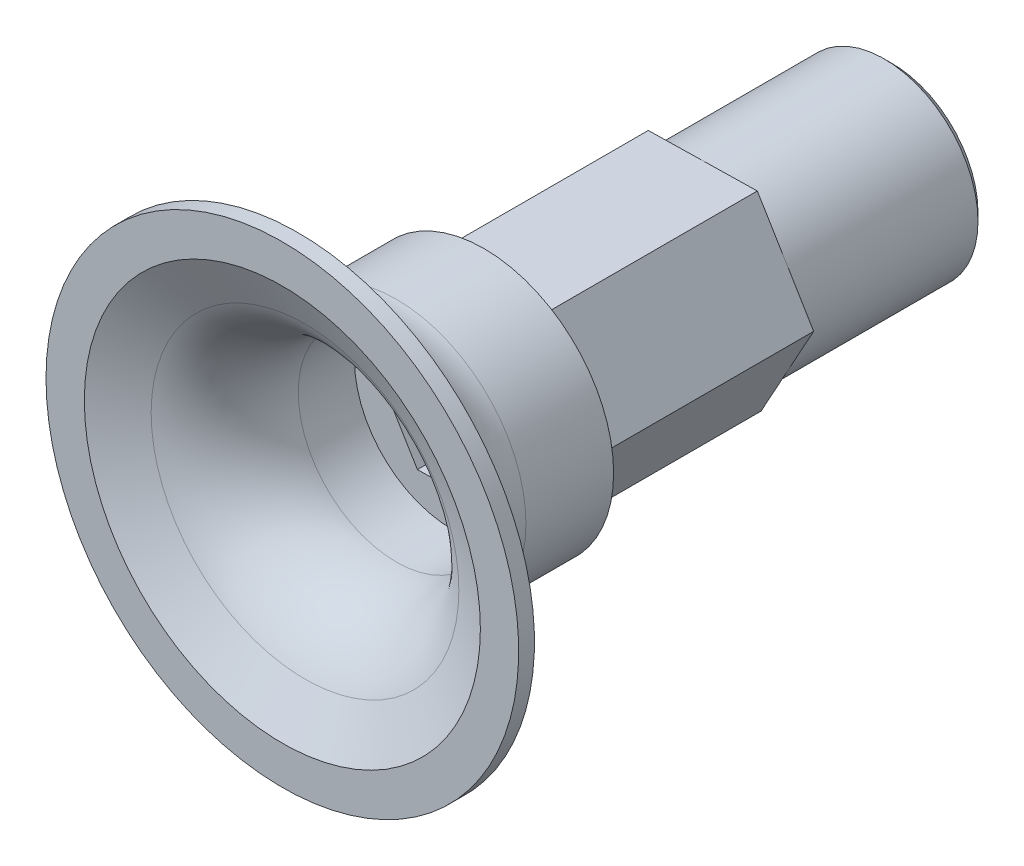
ISO-10303-21;
HEADER;
FILE_DESCRIPTION(('STEP AP214'),'2;1');
FILE_NAME('part.step','',(''),(''),'','','');
FILE_SCHEMA(('AUTOMOTIVE_DESIGN { 1 0 10303 214 1 1 1 1 }'));
ENDSEC;
DATA;
#1=APPLICATION_CONTEXT('core data for automotive mechanical design processes');
#2=APPLICATION_PROTOCOL_DEFINITION('international standard','automotive_design',2000,#1);
#3=PRODUCT_CONTEXT('',#1,'mechanical');
#4=PRODUCT('Part','Part','',(#3));
#5=PRODUCT_RELATED_PRODUCT_CATEGORY('part','',(#4));
#6=PRODUCT_DEFINITION_FORMATION('','',#4);
#7=PRODUCT_DEFINITION_CONTEXT('part definition',#1,'design');
#8=PRODUCT_DEFINITION('design','',#6,#7);
#9=PRODUCT_DEFINITION_SHAPE('','',#8);
#10=(LENGTH_UNIT() NAMED_UNIT(*) SI_UNIT(.MILLI.,.METRE.));
#11=(NAMED_UNIT(*) PLANE_ANGLE_UNIT() SI_UNIT($,.RADIAN.));
#12=(NAMED_UNIT(*) SI_UNIT($,.STERADIAN.) SOLID_ANGLE_UNIT());
#13=UNCERTAINTY_MEASURE_WITH_UNIT(LENGTH_MEASURE(1.E-05),#10,'distance_accuracy_value','');
#14=(GEOMETRIC_REPRESENTATION_CONTEXT(3) GLOBAL_UNCERTAINTY_ASSIGNED_CONTEXT((#13)) GLOBAL_UNIT_ASSIGNED_CONTEXT((#10,
#11,#12)) REPRESENTATION_CONTEXT('',''));
#15=CARTESIAN_POINT('',(0.,0.,0.));
#16=DIRECTION('',(0.,0.,1.));
#17=DIRECTION('',(1.,0.,0.));
#18=AXIS2_PLACEMENT_3D('',#15,#16,#17);
#19=CARTESIAN_POINT('',(0.,0.,11.9));
#20=DIRECTION('',(0.,0.,-1.));
#21=DIRECTION('',(-1.,0.,0.));
#22=AXIS2_PLACEMENT_3D('',#19,#20,#21);
#23=CYLINDRICAL_SURFACE('',#22,5.95);
#24=CARTESIAN_POINT('',(0.,0.,0.499999999999997));
#25=DIRECTION('',(0.,0.,1.));
#26=DIRECTION('',(1.,0.,0.));
#27=AXIS2_PLACEMENT_3D('',#24,#25,#26);
#28=CIRCLE('',#27,5.95);
#29=CARTESIAN_POINT('',(5.95,0.,0.499999999999997));
#30=VERTEX_POINT('',#29);
#31=EDGE_CURVE('E44',#30,#30,#28,.T.);
#32=ORIENTED_EDGE('',*,*,#31,.T.);
#33=EDGE_LOOP('',(#32));
#34=FACE_BOUND('',#33,.T.);
#35=CARTESIAN_POINT('',(0.,0.,11.9));
#36=DIRECTION('',(0.,0.,1.));
#37=DIRECTION('',(1.,0.,0.));
#38=AXIS2_PLACEMENT_3D('',#35,#36,#37);
#39=CIRCLE('',#38,5.95);
#40=CARTESIAN_POINT('',(5.95,0.,11.9));
#41=VERTEX_POINT('',#40);
#42=EDGE_CURVE('E151',#41,#41,#39,.T.);
#43=ORIENTED_EDGE('',*,*,#42,.F.);
#44=EDGE_LOOP('',(#43));
#45=FACE_BOUND('',#44,.T.);
#46=ADVANCED_FACE('F34',(#34,#45),#23,.T.);
#47=CARTESIAN_POINT('',(0.,0.,0.));
#48=DIRECTION('',(0.,0.,1.));
#49=DIRECTION('',(1.,0.,0.));
#50=AXIS2_PLACEMENT_3D('',#47,#48,#49);
#51=PLANE('',#50);
#52=CARTESIAN_POINT('',(0.,0.,0.));
#53=DIRECTION('',(0.,0.,1.));
#54=DIRECTION('',(1.,0.,0.));
#55=AXIS2_PLACEMENT_3D('',#52,#53,#54);
#56=CIRCLE('',#55,5.45);
#57=CARTESIAN_POINT('',(5.45,0.,0.));
#58=VERTEX_POINT('',#57);
#59=EDGE_CURVE('E11',#58,#58,#56,.F.);
#60=ORIENTED_EDGE('',*,*,#59,.T.);
#61=EDGE_LOOP('',(#60));
#62=FACE_BOUND('',#61,.T.);
#63=CARTESIAN_POINT('',(0.,0.,0.));
#64=DIRECTION('',(0.,0.,-1.));
#65=DIRECTION('',(-1.,0.,0.));
#66=AXIS2_PLACEMENT_3D('',#63,#64,#65);
#67=CIRCLE('',#66,2.5);
#68=CARTESIAN_POINT('',(-2.5,0.,0.));
#69=VERTEX_POINT('',#68);
#70=EDGE_CURVE('E148',#69,#69,#67,.T.);
#71=ORIENTED_EDGE('',*,*,#70,.F.);
#72=EDGE_LOOP('',(#71));
#73=FACE_BOUND('',#72,.T.);
#74=ADVANCED_FACE('F173',(#62,#73),#51,.F.);
#75=CARTESIAN_POINT('',(0.,0.,0.));
#76=DIRECTION('',(0.,0.,-1.));
#77=DIRECTION('',(-1.,0.,0.));
#78=AXIS2_PLACEMENT_3D('',#75,#76,#77);
#79=CYLINDRICAL_SURFACE('',#78,2.5);
#80=ORIENTED_EDGE('',*,*,#70,.T.);
#81=EDGE_LOOP('',(#80));
#82=FACE_BOUND('',#81,.T.);
#83=CARTESIAN_POINT('',(0.,0.,13.9));
#84=DIRECTION('',(0.,0.,1.));
#85=DIRECTION('',(1.,0.,0.));
#86=AXIS2_PLACEMENT_3D('',#83,#84,#85);
#87=CIRCLE('',#86,2.5);
#88=CARTESIAN_POINT('',(2.5,0.,13.9));
#89=VERTEX_POINT('',#88);
#90=EDGE_CURVE('E38',#89,#89,#87,.T.);
#91=ORIENTED_EDGE('',*,*,#90,.T.);
#92=EDGE_LOOP('',(#91));
#93=FACE_BOUND('',#92,.T.);
#94=ADVANCED_FACE('F177',(#82,#93),#79,.F.);
#95=CARTESIAN_POINT('',(0.,0.,11.9));
#96=DIRECTION('',(0.,0.,1.));
#97=DIRECTION('',(1.,0.,0.));
#98=AXIS2_PLACEMENT_3D('',#95,#96,#97);
#99=PLANE('',#98);
#100=ORIENTED_EDGE('',*,*,#42,.T.);
#101=EDGE_LOOP('',(#100));
#102=FACE_BOUND('',#101,.T.);
#103=DIRECTION('',(0.483063741289001,0.875585188232346,0.));
#104=VECTOR('',#103,1.);
#105=CARTESIAN_POINT('',(3.57725463297833,-5.92673590649779,11.9));
#106=LINE('',#105,#104);
#107=CARTESIAN_POINT('',(3.57725463297833,-5.92673590649779,11.9));
#108=VERTEX_POINT('',#107);
#109=CARTESIAN_POINT('',(6.92133117303764,0.134625434715919,11.9));
#110=VERTEX_POINT('',#109);
#111=EDGE_CURVE('E131',#108,#110,#106,.T.);
#112=ORIENTED_EDGE('',*,*,#111,.F.);
#113=DIRECTION('',(0.999810886831092,0.0194471225127449,0.));
#114=VECTOR('',#113,1.);
#115=CARTESIAN_POINT('',(-3.34407654005931,-6.06136134121371,11.9));
#116=LINE('',#115,#114);
#117=CARTESIAN_POINT('',(-3.34407654005931,-6.06136134121371,11.9));
#118=VERTEX_POINT('',#117);
#119=EDGE_CURVE('E80',#118,#108,#116,.T.);
#120=ORIENTED_EDGE('',*,*,#119,.F.);
#121=DIRECTION('',(0.516747145542091,-0.856138065719602,0.));
#122=VECTOR('',#121,1.);
#123=CARTESIAN_POINT('',(-6.92133117303764,-0.134625434715916,11.9));
#124=LINE('',#123,#122);
#125=CARTESIAN_POINT('',(-6.92133117303764,-0.134625434715916,11.9));
#126=VERTEX_POINT('',#125);
#127=EDGE_CURVE('E74',#126,#118,#124,.T.);
#128=ORIENTED_EDGE('',*,*,#127,.F.);
#129=DIRECTION('',(-0.483063741289001,-0.875585188232346,0.));
#130=VECTOR('',#129,1.);
#131=CARTESIAN_POINT('',(-3.57725463297833,5.92673590649779,11.9));
#132=LINE('',#131,#130);
#133=CARTESIAN_POINT('',(-3.57725463297833,5.92673590649779,11.9));
#134=VERTEX_POINT('',#133);
#135=EDGE_CURVE('E138',#134,#126,#132,.T.);
#136=ORIENTED_EDGE('',*,*,#135,.F.);
#137=DIRECTION('',(-0.999810886831092,-0.0194471225127445,0.));
#138=VECTOR('',#137,1.);
#139=CARTESIAN_POINT('',(3.34407654005931,6.0613613412137,11.9));
#140=LINE('',#139,#138);
#141=CARTESIAN_POINT('',(3.34407654005931,6.0613613412137,11.9));
#142=VERTEX_POINT('',#141);
#143=EDGE_CURVE('E105',#142,#134,#140,.T.);
#144=ORIENTED_EDGE('',*,*,#143,.F.);
#145=DIRECTION('',(-0.516747145542091,0.856138065719601,0.));
#146=VECTOR('',#145,1.);
#147=CARTESIAN_POINT('',(6.92133117303764,0.134625434715919,11.9));
#148=LINE('',#147,#146);
#149=EDGE_CURVE('E134',#110,#142,#148,.T.);
#150=ORIENTED_EDGE('',*,*,#149,.F.);
#151=EDGE_LOOP('',(#112,#120,#128,#136,#144,#150));
#152=FACE_BOUND('',#151,.T.);
#153=ADVANCED_FACE('F183',(#102,#152),#99,.F.);
#154=CARTESIAN_POINT('',(-3.34407654005931,-6.06136134121371,25.9));
#155=DIRECTION('',(-0.0194471225127449,0.999810886831092,0.));
#156=DIRECTION('',(-0.999810886831092,-0.0194471225127449,0.));
#157=AXIS2_PLACEMENT_3D('',#154,#155,#156);
#158=PLANE('',#157);
#159=ORIENTED_EDGE('',*,*,#119,.T.);
#160=DIRECTION('',(0.,0.,-1.));
#161=VECTOR('',#160,1.);
#162=CARTESIAN_POINT('',(3.57725463297833,-5.92673590649779,25.9));
#163=LINE('',#162,#161);
#164=CARTESIAN_POINT('',(3.57725463297833,-5.92673590649779,25.9));
#165=VERTEX_POINT('',#164);
#166=EDGE_CURVE('E130',#165,#108,#163,.T.);
#167=ORIENTED_EDGE('',*,*,#166,.F.);
#168=DIRECTION('',(0.999810886831092,0.0194471225127449,0.));
#169=VECTOR('',#168,1.);
#170=CARTESIAN_POINT('',(-3.34407654005931,-6.06136134121371,25.9));
#171=LINE('',#170,#169);
#172=CARTESIAN_POINT('',(-3.34407654005931,-6.06136134121371,25.9));
#173=VERTEX_POINT('',#172);
#174=EDGE_CURVE('E128',#173,#165,#171,.T.);
#175=ORIENTED_EDGE('',*,*,#174,.F.);
#176=DIRECTION('',(0.,0.,-1.));
#177=VECTOR('',#176,1.);
#178=CARTESIAN_POINT('',(-3.34407654005931,-6.06136134121371,25.9));
#179=LINE('',#178,#177);
#180=EDGE_CURVE('E52',#173,#118,#179,.T.);
#181=ORIENTED_EDGE('',*,*,#180,.T.);
#182=EDGE_LOOP('',(#159,#167,#175,#181));
#183=FACE_BOUND('',#182,.T.);
#184=ADVANCED_FACE('F200',(#183),#158,.F.);
#185=CARTESIAN_POINT('',(-6.92133117303764,-0.134625434715916,25.9));
#186=DIRECTION('',(0.856138065719602,0.516747145542091,0.));
#187=DIRECTION('',(-0.516747145542091,0.856138065719602,0.));
#188=AXIS2_PLACEMENT_3D('',#185,#186,#187);
#189=PLANE('',#188);
#190=ORIENTED_EDGE('',*,*,#127,.T.);
#191=ORIENTED_EDGE('',*,*,#180,.F.);
#192=DIRECTION('',(0.516747145542091,-0.856138065719602,0.));
#193=VECTOR('',#192,1.);
#194=CARTESIAN_POINT('',(-6.92133117303764,-0.134625434715916,25.9));
#195=LINE('',#194,#193);
#196=CARTESIAN_POINT('',(-6.92133117303764,-0.134625434715916,25.9));
#197=VERTEX_POINT('',#196);
#198=EDGE_CURVE('E116',#197,#173,#195,.T.);
#199=ORIENTED_EDGE('',*,*,#198,.F.);
#200=DIRECTION('',(0.,0.,-1.));
#201=VECTOR('',#200,1.);
#202=CARTESIAN_POINT('',(-6.92133117303764,-0.134625434715916,25.9));
#203=LINE('',#202,#201);
#204=EDGE_CURVE('E109',#197,#126,#203,.T.);
#205=ORIENTED_EDGE('',*,*,#204,.T.);
#206=EDGE_LOOP('',(#190,#191,#199,#205));
#207=FACE_BOUND('',#206,.T.);
#208=ADVANCED_FACE('F197',(#207),#189,.F.);
#209=CARTESIAN_POINT('',(-3.57725463297833,5.92673590649779,25.9));
#210=DIRECTION('',(0.875585188232346,-0.483063741289001,0.));
#211=DIRECTION('',(0.483063741289001,0.875585188232346,0.));
#212=AXIS2_PLACEMENT_3D('',#209,#210,#211);
#213=PLANE('',#212);
#214=ORIENTED_EDGE('',*,*,#135,.T.);
#215=ORIENTED_EDGE('',*,*,#204,.F.);
#216=DIRECTION('',(-0.483063741289001,-0.875585188232346,0.));
#217=VECTOR('',#216,1.);
#218=CARTESIAN_POINT('',(-3.57725463297833,5.92673590649779,25.9));
#219=LINE('',#218,#217);
#220=CARTESIAN_POINT('',(-3.57725463297833,5.92673590649779,25.9));
#221=VERTEX_POINT('',#220);
#222=EDGE_CURVE('E112',#221,#197,#219,.T.);
#223=ORIENTED_EDGE('',*,*,#222,.F.);
#224=DIRECTION('',(0.,0.,-1.));
#225=VECTOR('',#224,1.);
#226=CARTESIAN_POINT('',(-3.57725463297833,5.92673590649779,25.9));
#227=LINE('',#226,#225);
#228=EDGE_CURVE('E98',#221,#134,#227,.T.);
#229=ORIENTED_EDGE('',*,*,#228,.T.);
#230=EDGE_LOOP('',(#214,#215,#223,#229));
#231=FACE_BOUND('',#230,.T.);
#232=ADVANCED_FACE('F113',(#231),#213,.F.);
#233=CARTESIAN_POINT('',(3.34407654005931,6.0613613412137,25.9));
#234=DIRECTION('',(0.0194471225127445,-0.999810886831092,0.));
#235=DIRECTION('',(0.999810886831092,0.0194471225127445,0.));
#236=AXIS2_PLACEMENT_3D('',#233,#234,#235);
#237=PLANE('',#236);
#238=ORIENTED_EDGE('',*,*,#143,.T.);
#239=ORIENTED_EDGE('',*,*,#228,.F.);
#240=DIRECTION('',(-0.999810886831092,-0.0194471225127445,0.));
#241=VECTOR('',#240,1.);
#242=CARTESIAN_POINT('',(3.34407654005931,6.0613613412137,25.9));
#243=LINE('',#242,#241);
#244=CARTESIAN_POINT('',(3.34407654005931,6.0613613412137,25.9));
#245=VERTEX_POINT('',#244);
#246=EDGE_CURVE('E103',#245,#221,#243,.T.);
#247=ORIENTED_EDGE('',*,*,#246,.F.);
#248=DIRECTION('',(0.,0.,-1.));
#249=VECTOR('',#248,1.);
#250=CARTESIAN_POINT('',(3.34407654005931,6.0613613412137,25.9));
#251=LINE('',#250,#249);
#252=EDGE_CURVE('E108',#245,#142,#251,.T.);
#253=ORIENTED_EDGE('',*,*,#252,.T.);
#254=EDGE_LOOP('',(#238,#239,#247,#253));
#255=FACE_BOUND('',#254,.T.);
#256=ADVANCED_FACE('F100',(#255),#237,.F.);
#257=CARTESIAN_POINT('',(6.92133117303764,0.134625434715919,25.9));
#258=DIRECTION('',(-0.856138065719601,-0.516747145542091,0.));
#259=DIRECTION('',(0.516747145542091,-0.856138065719602,0.));
#260=AXIS2_PLACEMENT_3D('',#257,#258,#259);
#261=PLANE('',#260);
#262=ORIENTED_EDGE('',*,*,#149,.T.);
#263=ORIENTED_EDGE('',*,*,#252,.F.);
#264=DIRECTION('',(-0.516747145542091,0.856138065719601,0.));
#265=VECTOR('',#264,1.);
#266=CARTESIAN_POINT('',(6.92133117303764,0.134625434715919,25.9));
#267=LINE('',#266,#265);
#268=CARTESIAN_POINT('',(6.92133117303764,0.134625434715919,25.9));
#269=VERTEX_POINT('',#268);
#270=EDGE_CURVE('E89',#269,#245,#267,.T.);
#271=ORIENTED_EDGE('',*,*,#270,.F.);
#272=DIRECTION('',(0.,0.,-1.));
#273=VECTOR('',#272,1.);
#274=CARTESIAN_POINT('',(6.92133117303764,0.134625434715919,25.9));
#275=LINE('',#274,#273);
#276=EDGE_CURVE('E146',#269,#110,#275,.T.);
#277=ORIENTED_EDGE('',*,*,#276,.T.);
#278=EDGE_LOOP('',(#262,#263,#271,#277));
#279=FACE_BOUND('',#278,.T.);
#280=ADVANCED_FACE('F189',(#279),#261,.F.);
#281=CARTESIAN_POINT('',(3.57725463297833,-5.92673590649779,25.9));
#282=DIRECTION('',(-0.875585188232346,0.483063741289001,0.));
#283=DIRECTION('',(-0.483063741289001,-0.875585188232346,0.));
#284=AXIS2_PLACEMENT_3D('',#281,#282,#283);
#285=PLANE('',#284);
#286=ORIENTED_EDGE('',*,*,#111,.T.);
#287=ORIENTED_EDGE('',*,*,#276,.F.);
#288=DIRECTION('',(0.483063741289001,0.875585188232346,0.));
#289=VECTOR('',#288,1.);
#290=CARTESIAN_POINT('',(3.57725463297833,-5.92673590649779,25.9));
#291=LINE('',#290,#289);
#292=EDGE_CURVE('E123',#165,#269,#291,.T.);
#293=ORIENTED_EDGE('',*,*,#292,.F.);
#294=ORIENTED_EDGE('',*,*,#166,.T.);
#295=EDGE_LOOP('',(#286,#287,#293,#294));
#296=FACE_BOUND('',#295,.T.);
#297=ADVANCED_FACE('F185',(#296),#285,.F.);
#298=CARTESIAN_POINT('',(-15.,0.,38.7));
#299=DIRECTION('',(0.,0.,1.));
#300=DIRECTION('',(1.,0.,0.));
#301=AXIS2_PLACEMENT_3D('',#298,#299,#300);
#302=PLANE('',#301);
#303=CARTESIAN_POINT('',(0.,0.,38.7));
#304=DIRECTION('',(0.,0.,1.));
#305=DIRECTION('',(1.,0.,0.));
#306=AXIS2_PLACEMENT_3D('',#303,#304,#305);
#307=CIRCLE('',#306,12.5678669160536);
#308=CARTESIAN_POINT('',(12.5678669160536,0.,38.7));
#309=VERTEX_POINT('',#308);
#310=EDGE_CURVE('E329',#309,#309,#307,.T.);
#311=ORIENTED_EDGE('',*,*,#310,.F.);
#312=EDGE_LOOP('',(#311));
#313=FACE_BOUND('',#312,.T.);
#314=CARTESIAN_POINT('',(0.,0.,38.7));
#315=DIRECTION('',(0.,0.,-1.));
#316=DIRECTION('',(-1.,0.,0.));
#317=AXIS2_PLACEMENT_3D('',#314,#315,#316);
#318=CIRCLE('',#317,15.);
#319=CARTESIAN_POINT('',(-15.,0.,38.7));
#320=VERTEX_POINT('',#319);
#321=EDGE_CURVE('E135',#320,#320,#318,.T.);
#322=ORIENTED_EDGE('',*,*,#321,.F.);
#323=EDGE_LOOP('',(#322));
#324=FACE_BOUND('',#323,.T.);
#325=ADVANCED_FACE('F188',(#313,#324),#302,.T.);
#326=CARTESIAN_POINT('',(0.,0.,0.));
#327=DIRECTION('',(0.,0.,-1.));
#328=DIRECTION('',(-1.,0.,0.));
#329=AXIS2_PLACEMENT_3D('',#326,#327,#328);
#330=CYLINDRICAL_SURFACE('',#329,15.);
#331=ORIENTED_EDGE('',*,*,#321,.T.);
#332=EDGE_LOOP('',(#331));
#333=FACE_BOUND('',#332,.T.);
#334=CARTESIAN_POINT('',(0.,0.,37.7));
#335=DIRECTION('',(0.,0.,-1.));
#336=DIRECTION('',(-1.,0.,0.));
#337=AXIS2_PLACEMENT_3D('',#334,#335,#336);
#338=CIRCLE('',#337,15.);
#339=CARTESIAN_POINT('',(-15.,0.,37.7));
#340=VERTEX_POINT('',#339);
#341=EDGE_CURVE('E351',#340,#340,#338,.T.);
#342=ORIENTED_EDGE('',*,*,#341,.F.);
#343=EDGE_LOOP('',(#342));
#344=FACE_BOUND('',#343,.T.);
#345=ADVANCED_FACE('F208',(#333,#344),#330,.T.);
#346=CARTESIAN_POINT('',(0.,0.,35.4821019097098));
#347=DIRECTION('',(0.,0.,1.));
#348=DIRECTION('',(1.,0.,0.));
#349=AXIS2_PLACEMENT_3D('',#346,#347,#348);
#350=CONICAL_SURFACE('',#349,10.6773415950138,1.09673433436166);
#351=ORIENTED_EDGE('',*,*,#341,.T.);
#352=EDGE_LOOP('',(#351));
#353=FACE_BOUND('',#352,.T.);
#354=CARTESIAN_POINT('',(0.,0.,35.4821019097098));
#355=DIRECTION('',(0.,0.,-1.));
#356=DIRECTION('',(-1.,0.,0.));
#357=AXIS2_PLACEMENT_3D('',#354,#355,#356);
#358=CIRCLE('',#357,10.6773415950138);
#359=CARTESIAN_POINT('',(-10.6773415950138,0.,35.4821019097098));
#360=VERTEX_POINT('',#359);
#361=EDGE_CURVE('E348',#360,#360,#358,.T.);
#362=ORIENTED_EDGE('',*,*,#361,.F.);
#363=EDGE_LOOP('',(#362));
#364=FACE_BOUND('',#363,.T.);
#365=ADVANCED_FACE('F212',(#353,#364),#350,.T.);
#366=CARTESIAN_POINT('',(0.,0.,31.4662441523821));
#367=DIRECTION('',(0.,0.,-1.));
#368=DIRECTION('',(-1.,0.,0.));
#369=AXIS2_PLACEMENT_3D('',#366,#367,#368);
#370=TOROIDAL_SURFACE('',#369,12.7378243850904,4.5136130599876);
#371=ORIENTED_EDGE('',*,*,#361,.T.);
#372=EDGE_LOOP('',(#371));
#373=FACE_BOUND('',#372,.T.);
#374=CARTESIAN_POINT('',(0.,0.,31.4662441523821));
#375=DIRECTION('',(0.,0.,-1.));
#376=DIRECTION('',(-1.,0.,0.));
#377=AXIS2_PLACEMENT_3D('',#374,#375,#376);
#378=CIRCLE('',#377,8.22421132510284);
#379=CARTESIAN_POINT('',(-8.22421132510284,0.,31.4662441523821));
#380=VERTEX_POINT('',#379);
#381=EDGE_CURVE('E345',#380,#380,#378,.T.);
#382=ORIENTED_EDGE('',*,*,#381,.F.);
#383=EDGE_LOOP('',(#382));
#384=FACE_BOUND('',#383,.T.);
#385=ADVANCED_FACE('F216',(#373,#384),#370,.F.);
#386=CARTESIAN_POINT('',(0.,0.,0.));
#387=DIRECTION('',(0.,0.,-1.));
#388=DIRECTION('',(-1.,0.,0.));
#389=AXIS2_PLACEMENT_3D('',#386,#387,#388);
#390=CYLINDRICAL_SURFACE('',#389,8.22421132510284);
#391=ORIENTED_EDGE('',*,*,#381,.T.);
#392=EDGE_LOOP('',(#391));
#393=FACE_BOUND('',#392,.T.);
#394=CARTESIAN_POINT('',(0.,0.,25.9));
#395=DIRECTION('',(0.,0.,-1.));
#396=DIRECTION('',(-1.,0.,0.));
#397=AXIS2_PLACEMENT_3D('',#394,#395,#396);
#398=CIRCLE('',#397,8.22421132510284);
#399=CARTESIAN_POINT('',(-8.22421132510284,0.,25.9));
#400=VERTEX_POINT('',#399);
#401=EDGE_CURVE('E342',#400,#400,#398,.T.);
#402=ORIENTED_EDGE('',*,*,#401,.F.);
#403=EDGE_LOOP('',(#402));
#404=FACE_BOUND('',#403,.T.);
#405=ADVANCED_FACE('F169',(#393,#404),#390,.T.);
#406=CARTESIAN_POINT('',(-6.92133117303764,0.,25.9));
#407=DIRECTION('',(0.,0.,-1.));
#408=DIRECTION('',(-1.,0.,0.));
#409=AXIS2_PLACEMENT_3D('',#406,#407,#408);
#410=PLANE('',#409);
#411=ORIENTED_EDGE('',*,*,#174,.T.);
#412=ORIENTED_EDGE('',*,*,#292,.T.);
#413=ORIENTED_EDGE('',*,*,#270,.T.);
#414=ORIENTED_EDGE('',*,*,#246,.T.);
#415=ORIENTED_EDGE('',*,*,#222,.T.);
#416=ORIENTED_EDGE('',*,*,#198,.T.);
#417=EDGE_LOOP('',(#411,#412,#413,#414,#415,#416));
#418=FACE_BOUND('',#417,.T.);
#419=ORIENTED_EDGE('',*,*,#401,.T.);
#420=EDGE_LOOP('',(#419));
#421=FACE_BOUND('',#420,.T.);
#422=ADVANCED_FACE('F119',(#418,#421),#410,.T.);
#423=CARTESIAN_POINT('',(0.,0.,0.499999999999997));
#424=DIRECTION('',(0.,0.,1.));
#425=DIRECTION('',(1.,0.,0.));
#426=AXIS2_PLACEMENT_3D('',#423,#424,#425);
#427=CONICAL_SURFACE('',#426,5.95,0.785398163397448);
#428=ORIENTED_EDGE('',*,*,#59,.F.);
#429=EDGE_LOOP('',(#428));
#430=FACE_BOUND('',#429,.T.);
#431=ORIENTED_EDGE('',*,*,#31,.F.);
#432=EDGE_LOOP('',(#431));
#433=FACE_BOUND('',#432,.T.);
#434=ADVANCED_FACE('F36',(#430,#433),#427,.T.);
#435=CARTESIAN_POINT('',(0.,0.,13.9));
#436=DIRECTION('',(0.,0.,1.));
#437=DIRECTION('',(1.,0.,0.));
#438=AXIS2_PLACEMENT_3D('',#435,#436,#437);
#439=PLANE('',#438);
#440=ORIENTED_EDGE('',*,*,#90,.F.);
#441=EDGE_LOOP('',(#440));
#442=FACE_BOUND('',#441,.T.);
#443=DIRECTION('',(-0.516747145542091,0.856138065719602,0.));
#444=VECTOR('',#443,1.);
#445=CARTESIAN_POINT('',(5.20905504159844,-0.898868856368264,13.9));
#446=LINE('',#445,#444);
#447=CARTESIAN_POINT('',(4.61236683443504,0.0897142290451316,13.9));
#448=VERTEX_POINT('',#447);
#449=CARTESIAN_POINT('',(2.2284886157835,4.03928396471613,13.9));
#450=VERTEX_POINT('',#449);
#451=EDGE_CURVE('E300',#448,#450,#446,.T.);
#452=ORIENTED_EDGE('',*,*,#451,.T.);
#453=DIRECTION('',(-0.999810886831092,-0.0194471225127445,0.));
#454=VECTOR('',#453,1.);
#455=CARTESIAN_POINT('',(3.3829707850848,4.06173956755152,13.9));
#456=LINE('',#455,#454);
#457=CARTESIAN_POINT('',(-2.38387821865154,3.949569735671,13.9));
#458=VERTEX_POINT('',#457);
#459=EDGE_CURVE('E297',#450,#458,#456,.T.);
#460=ORIENTED_EDGE('',*,*,#459,.T.);
#461=DIRECTION('',(-0.483063741289001,-0.875585188232346,0.));
#462=VECTOR('',#461,1.);
#463=CARTESIAN_POINT('',(-1.82608425651363,4.96060842391979,13.9));
#464=LINE('',#463,#462);
#465=CARTESIAN_POINT('',(-4.61236683443504,-0.08971422904513,13.9));
#466=VERTEX_POINT('',#465);
#467=EDGE_CURVE('E290',#458,#466,#464,.T.);
#468=ORIENTED_EDGE('',*,*,#467,.T.);
#469=DIRECTION('',(0.516747145542091,-0.856138065719602,0.));
#470=VECTOR('',#469,1.);
#471=CARTESIAN_POINT('',(-5.20905504159844,0.898868856368266,13.9));
#472=LINE('',#471,#470);
#473=CARTESIAN_POINT('',(-2.2284886157835,-4.03928396471613,13.9));
#474=VERTEX_POINT('',#473);
#475=EDGE_CURVE('E285',#466,#474,#472,.T.);
#476=ORIENTED_EDGE('',*,*,#475,.T.);
#477=DIRECTION('',(0.999810886831092,0.0194471225127449,0.));
#478=VECTOR('',#477,1.);
#479=CARTESIAN_POINT('',(-3.3829707850848,-4.06173956755152,13.9));
#480=LINE('',#479,#478);
#481=CARTESIAN_POINT('',(2.38387821865154,-3.949569735671,13.9));
#482=VERTEX_POINT('',#481);
#483=EDGE_CURVE('E269',#474,#482,#480,.T.);
#484=ORIENTED_EDGE('',*,*,#483,.T.);
#485=DIRECTION('',(0.483063741289001,0.875585188232346,0.));
#486=VECTOR('',#485,1.);
#487=CARTESIAN_POINT('',(1.82608425651363,-4.96060842391979,13.9));
#488=LINE('',#487,#486);
#489=EDGE_CURVE('E293',#482,#448,#488,.T.);
#490=ORIENTED_EDGE('',*,*,#489,.T.);
#491=EDGE_LOOP('',(#452,#460,#468,#476,#484,#490));
#492=FACE_BOUND('',#491,.T.);
#493=ADVANCED_FACE('F160',(#442,#492),#439,.T.);
#494=CARTESIAN_POINT('',(-3.3829707850848,-4.06173956755152,25.9));
#495=DIRECTION('',(-0.0194471225127449,0.999810886831092,0.));
#496=DIRECTION('',(-0.999810886831092,-0.0194471225127449,0.));
#497=AXIS2_PLACEMENT_3D('',#494,#495,#496);
#498=PLANE('',#497);
#499=ORIENTED_EDGE('',*,*,#483,.F.);
#500=DIRECTION('',(0.,0.,-1.));
#501=VECTOR('',#500,1.);
#502=CARTESIAN_POINT('',(-2.2284886157835,-4.03928396471613,25.9));
#503=LINE('',#502,#501);
#504=CARTESIAN_POINT('',(-2.2284886157835,-4.03928396471613,27.9));
#505=VERTEX_POINT('',#504);
#506=EDGE_CURVE('E273',#505,#474,#503,.T.);
#507=ORIENTED_EDGE('',*,*,#506,.F.);
#508=DIRECTION('',(0.999810886831092,0.0194471225127449,0.));
#509=VECTOR('',#508,1.);
#510=CARTESIAN_POINT('',(-6.84101878939427,-4.12900137083905,27.9));
#511=LINE('',#510,#509);
#512=CARTESIAN_POINT('',(2.38387821865154,-3.949569735671,27.9));
#513=VERTEX_POINT('',#512);
#514=EDGE_CURVE('E304',#505,#513,#511,.T.);
#515=ORIENTED_EDGE('',*,*,#514,.T.);
#516=DIRECTION('',(0.,0.,-1.));
#517=VECTOR('',#516,1.);
#518=CARTESIAN_POINT('',(2.38387821865154,-3.949569735671,25.9));
#519=LINE('',#518,#517);
#520=EDGE_CURVE('E277',#513,#482,#519,.T.);
#521=ORIENTED_EDGE('',*,*,#520,.T.);
#522=EDGE_LOOP('',(#499,#507,#515,#521));
#523=FACE_BOUND('',#522,.T.);
#524=ADVANCED_FACE('F166',(#523),#498,.T.);
#525=CARTESIAN_POINT('',(-5.20905504159844,0.898868856368266,25.9));
#526=DIRECTION('',(0.856138065719602,0.516747145542091,0.));
#527=DIRECTION('',(-0.516747145542091,0.856138065719602,0.));
#528=AXIS2_PLACEMENT_3D('',#525,#526,#527);
#529=PLANE('',#528);
#530=ORIENTED_EDGE('',*,*,#475,.F.);
#531=DIRECTION('',(0.,0.,-1.));
#532=VECTOR('',#531,1.);
#533=CARTESIAN_POINT('',(-4.61236683443504,-0.08971422904513,25.9));
#534=LINE('',#533,#532);
#535=CARTESIAN_POINT('',(-4.61236683443504,-0.08971422904513,27.9));
#536=VERTEX_POINT('',#535);
#537=EDGE_CURVE('E308',#536,#466,#534,.T.);
#538=ORIENTED_EDGE('',*,*,#537,.F.);
#539=DIRECTION('',(0.516747145542091,-0.856138065719602,0.));
#540=VECTOR('',#539,1.);
#541=CARTESIAN_POINT('',(-5.26861426305446,0.997545582680192,27.9));
#542=LINE('',#541,#540);
#543=EDGE_CURVE('E306',#536,#505,#542,.T.);
#544=ORIENTED_EDGE('',*,*,#543,.T.);
#545=ORIENTED_EDGE('',*,*,#506,.T.);
#546=EDGE_LOOP('',(#530,#538,#544,#545));
#547=FACE_BOUND('',#546,.T.);
#548=ADVANCED_FACE('F255',(#547),#529,.T.);
#549=CARTESIAN_POINT('',(-1.82608425651363,4.96060842391979,25.9));
#550=DIRECTION('',(0.875585188232346,-0.483063741289001,0.));
#551=DIRECTION('',(0.483063741289001,0.875585188232346,0.));
#552=AXIS2_PLACEMENT_3D('',#549,#550,#551);
#553=PLANE('',#552);
#554=ORIENTED_EDGE('',*,*,#467,.F.);
#555=DIRECTION('',(0.,0.,-1.));
#556=VECTOR('',#555,1.);
#557=CARTESIAN_POINT('',(-2.38387821865154,3.949569735671,25.9));
#558=LINE('',#557,#556);
#559=CARTESIAN_POINT('',(-2.38387821865154,3.949569735671,27.9));
#560=VERTEX_POINT('',#559);
#561=EDGE_CURVE('E314',#560,#458,#558,.T.);
#562=ORIENTED_EDGE('',*,*,#561,.F.);
#563=DIRECTION('',(-0.483063741289001,-0.875585188232346,0.));
#564=VECTOR('',#563,1.);
#565=CARTESIAN_POINT('',(-5.11321915732628,-0.997542405602404,27.9));
#566=LINE('',#565,#564);
#567=EDGE_CURVE('E311',#560,#536,#566,.T.);
#568=ORIENTED_EDGE('',*,*,#567,.T.);
#569=ORIENTED_EDGE('',*,*,#537,.T.);
#570=EDGE_LOOP('',(#554,#562,#568,#569));
#571=FACE_BOUND('',#570,.T.);
#572=ADVANCED_FACE('F251',(#571),#553,.T.);
#573=CARTESIAN_POINT('',(3.3829707850848,4.06173956755152,25.9));
#574=DIRECTION('',(0.0194471225127445,-0.999810886831092,0.));
#575=DIRECTION('',(0.999810886831092,0.0194471225127445,0.));
#576=AXIS2_PLACEMENT_3D('',#573,#574,#575);
#577=PLANE('',#576);
#578=ORIENTED_EDGE('',*,*,#459,.F.);
#579=DIRECTION('',(0.,0.,-1.));
#580=VECTOR('',#579,1.);
#581=CARTESIAN_POINT('',(2.2284886157835,4.03928396471613,25.9));
#582=LINE('',#581,#580);
#583=CARTESIAN_POINT('',(2.2284886157835,4.03928396471613,27.9));
#584=VERTEX_POINT('',#583);
#585=EDGE_CURVE('E320',#584,#450,#582,.T.);
#586=ORIENTED_EDGE('',*,*,#585,.F.);
#587=DIRECTION('',(-0.999810886831092,-0.0194471225127445,0.));
#588=VECTOR('',#587,1.);
#589=CARTESIAN_POINT('',(-6.9964083922623,3.85985232954808,27.9));
#590=LINE('',#589,#588);
#591=EDGE_CURVE('E317',#584,#560,#590,.T.);
#592=ORIENTED_EDGE('',*,*,#591,.T.);
#593=ORIENTED_EDGE('',*,*,#561,.T.);
#594=EDGE_LOOP('',(#578,#586,#592,#593));
#595=FACE_BOUND('',#594,.T.);
#596=ADVANCED_FACE('F247',(#595),#577,.T.);
#597=CARTESIAN_POINT('',(5.20905504159844,-0.898868856368264,25.9));
#598=DIRECTION('',(-0.856138065719601,-0.516747145542091,0.));
#599=DIRECTION('',(0.516747145542091,-0.856138065719602,0.));
#600=AXIS2_PLACEMENT_3D('',#597,#598,#599);
#601=PLANE('',#600);
#602=ORIENTED_EDGE('',*,*,#451,.F.);
#603=DIRECTION('',(0.,0.,-1.));
#604=VECTOR('',#603,1.);
#605=CARTESIAN_POINT('',(4.61236683443504,0.0897142290451317,25.9));
#606=LINE('',#605,#604);
#607=CARTESIAN_POINT('',(4.61236683443504,0.0897142290451316,27.9));
#608=VERTEX_POINT('',#607);
#609=EDGE_CURVE('E325',#608,#448,#606,.T.);
#610=ORIENTED_EDGE('',*,*,#609,.F.);
#611=DIRECTION('',(-0.516747145542091,0.856138065719602,0.));
#612=VECTOR('',#611,1.);
#613=CARTESIAN_POINT('',(1.57224118716408,5.12654377644145,27.9));
#614=LINE('',#613,#612);
#615=EDGE_CURVE('E288',#608,#584,#614,.T.);
#616=ORIENTED_EDGE('',*,*,#615,.T.);
#617=ORIENTED_EDGE('',*,*,#585,.T.);
#618=EDGE_LOOP('',(#602,#610,#616,#617));
#619=FACE_BOUND('',#618,.T.);
#620=ADVANCED_FACE('F243',(#619),#601,.T.);
#621=CARTESIAN_POINT('',(1.82608425651363,-4.96060842391979,25.9));
#622=DIRECTION('',(-0.875585188232346,0.483063741289001,0.));
#623=DIRECTION('',(-0.483063741289001,-0.875585188232346,0.));
#624=AXIS2_PLACEMENT_3D('',#621,#622,#623);
#625=PLANE('',#624);
#626=ORIENTED_EDGE('',*,*,#489,.F.);
#627=ORIENTED_EDGE('',*,*,#520,.F.);
#628=DIRECTION('',(0.483063741289001,0.875585188232346,0.));
#629=VECTOR('',#628,1.);
#630=CARTESIAN_POINT('',(1.88302589576031,-4.85739791222827,27.9));
#631=LINE('',#630,#629);
#632=EDGE_CURVE('E284',#513,#608,#631,.T.);
#633=ORIENTED_EDGE('',*,*,#632,.T.);
#634=ORIENTED_EDGE('',*,*,#609,.T.);
#635=EDGE_LOOP('',(#626,#627,#633,#634));
#636=FACE_BOUND('',#635,.T.);
#637=ADVANCED_FACE('F239',(#636),#625,.T.);
#638=CARTESIAN_POINT('',(0.,0.,37.2615445442269));
#639=DIRECTION('',(0.,0.,1.));
#640=DIRECTION('',(1.,0.,0.));
#641=AXIS2_PLACEMENT_3D('',#638,#639,#640);
#642=CONICAL_SURFACE('',#641,9.76433342940808,1.09673433436166);
#643=ORIENTED_EDGE('',*,*,#310,.T.);
#644=EDGE_LOOP('',(#643));
#645=FACE_BOUND('',#644,.T.);
#646=CARTESIAN_POINT('',(0.,0.,37.2615445442269));
#647=DIRECTION('',(0.,0.,-1.));
#648=DIRECTION('',(-1.,0.,0.));
#649=AXIS2_PLACEMENT_3D('',#646,#647,#648);
#650=CIRCLE('',#649,9.76433342940808);
#651=CARTESIAN_POINT('',(-9.76433342940808,0.,37.2615445442269));
#652=VERTEX_POINT('',#651);
#653=EDGE_CURVE('E337',#652,#652,#650,.T.);
#654=ORIENTED_EDGE('',*,*,#653,.T.);
#655=EDGE_LOOP('',(#654));
#656=FACE_BOUND('',#655,.T.);
#657=ADVANCED_FACE('F235',(#645,#656),#642,.F.);
#658=CARTESIAN_POINT('',(0.,0.,31.4662441523821));
#659=DIRECTION('',(0.,0.,-1.));
#660=DIRECTION('',(-1.,0.,0.));
#661=AXIS2_PLACEMENT_3D('',#658,#659,#660);
#662=TOROIDAL_SURFACE('',#661,12.7378243850904,6.5136130599876);
#663=ORIENTED_EDGE('',*,*,#653,.F.);
#664=EDGE_LOOP('',(#663));
#665=FACE_BOUND('',#664,.T.);
#666=CARTESIAN_POINT('',(0.,0.,31.4662441523821));
#667=DIRECTION('',(0.,0.,-1.));
#668=DIRECTION('',(-1.,0.,0.));
#669=AXIS2_PLACEMENT_3D('',#666,#667,#668);
#670=CIRCLE('',#669,6.22421132510284);
#671=CARTESIAN_POINT('',(-6.22421132510284,0.,31.4662441523821));
#672=VERTEX_POINT('',#671);
#673=EDGE_CURVE('E334',#672,#672,#670,.T.);
#674=ORIENTED_EDGE('',*,*,#673,.T.);
#675=EDGE_LOOP('',(#674));
#676=FACE_BOUND('',#675,.T.);
#677=ADVANCED_FACE('F231',(#665,#676),#662,.T.);
#678=CARTESIAN_POINT('',(0.,0.,0.));
#679=DIRECTION('',(0.,0.,-1.));
#680=DIRECTION('',(-1.,0.,0.));
#681=AXIS2_PLACEMENT_3D('',#678,#679,#680);
#682=CYLINDRICAL_SURFACE('',#681,6.22421132510284);
#683=ORIENTED_EDGE('',*,*,#673,.F.);
#684=EDGE_LOOP('',(#683));
#685=FACE_BOUND('',#684,.T.);
#686=CARTESIAN_POINT('',(0.,0.,27.9));
#687=DIRECTION('',(0.,0.,-1.));
#688=DIRECTION('',(-1.,0.,0.));
#689=AXIS2_PLACEMENT_3D('',#686,#687,#688);
#690=CIRCLE('',#689,6.22421132510284);
#691=CARTESIAN_POINT('',(-6.22421132510284,0.,27.9));
#692=VERTEX_POINT('',#691);
#693=EDGE_CURVE('E331',#692,#692,#690,.T.);
#694=ORIENTED_EDGE('',*,*,#693,.T.);
#695=EDGE_LOOP('',(#694));
#696=FACE_BOUND('',#695,.T.);
#697=ADVANCED_FACE('F227',(#685,#696),#682,.F.);
#698=CARTESIAN_POINT('',(-6.92133117303764,0.,27.9));
#699=DIRECTION('',(0.,0.,-1.));
#700=DIRECTION('',(-1.,0.,0.));
#701=AXIS2_PLACEMENT_3D('',#698,#699,#700);
#702=PLANE('',#701);
#703=ORIENTED_EDGE('',*,*,#514,.F.);
#704=ORIENTED_EDGE('',*,*,#543,.F.);
#705=ORIENTED_EDGE('',*,*,#567,.F.);
#706=ORIENTED_EDGE('',*,*,#591,.F.);
#707=ORIENTED_EDGE('',*,*,#615,.F.);
#708=ORIENTED_EDGE('',*,*,#632,.F.);
#709=EDGE_LOOP('',(#703,#704,#705,#706,#707,#708));
#710=FACE_BOUND('',#709,.T.);
#711=ORIENTED_EDGE('',*,*,#693,.F.);
#712=EDGE_LOOP('',(#711));
#713=FACE_BOUND('',#712,.T.);
#714=ADVANCED_FACE('F224',(#710,#713),#702,.F.);
#715=CLOSED_SHELL('',(#46,#74,#94,#153,#184,#208,#232,#256,#280,#297,#325,#345,#365,#385,#405,
#422,#434,#493,#524,#548,#572,#596,#620,#637,#657,#677,#697,#714));
#716=MANIFOLD_SOLID_BREP('B2',#715);
#717=ADVANCED_BREP_SHAPE_REPRESENTATION('',(#18,#716),#14);
#718=SHAPE_DEFINITION_REPRESENTATION(#9,#717);
ENDSEC;
END-ISO-10303-21;
